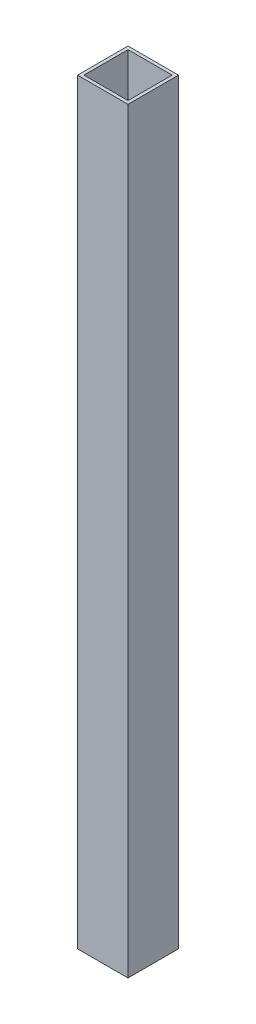
ISO-10303-21;
HEADER;
FILE_DESCRIPTION(('STEP AP214'),'2;1');
FILE_NAME('part.step','',(''),(''),'','','');
FILE_SCHEMA(('AUTOMOTIVE_DESIGN { 1 0 10303 214 1 1 1 1 }'));
ENDSEC;
DATA;
#1=APPLICATION_CONTEXT('core data for automotive mechanical design processes');
#2=APPLICATION_PROTOCOL_DEFINITION('international standard','automotive_design',2000,#1);
#3=PRODUCT_CONTEXT('',#1,'mechanical');
#4=PRODUCT('Part','Part','',(#3));
#5=PRODUCT_RELATED_PRODUCT_CATEGORY('part','',(#4));
#6=PRODUCT_DEFINITION_FORMATION('','',#4);
#7=PRODUCT_DEFINITION_CONTEXT('part definition',#1,'design');
#8=PRODUCT_DEFINITION('design','',#6,#7);
#9=PRODUCT_DEFINITION_SHAPE('','',#8);
#10=(LENGTH_UNIT() NAMED_UNIT(*) SI_UNIT(.MILLI.,.METRE.));
#11=(NAMED_UNIT(*) PLANE_ANGLE_UNIT() SI_UNIT($,.RADIAN.));
#12=(NAMED_UNIT(*) SI_UNIT($,.STERADIAN.) SOLID_ANGLE_UNIT());
#13=UNCERTAINTY_MEASURE_WITH_UNIT(LENGTH_MEASURE(1.E-05),#10,'distance_accuracy_value','');
#14=(GEOMETRIC_REPRESENTATION_CONTEXT(3) GLOBAL_UNCERTAINTY_ASSIGNED_CONTEXT((#13)) GLOBAL_UNIT_ASSIGNED_CONTEXT((#10,
#11,#12)) REPRESENTATION_CONTEXT('',''));
#15=CARTESIAN_POINT('',(0.,0.,0.));
#16=DIRECTION('',(0.,0.,1.));
#17=DIRECTION('',(1.,0.,0.));
#18=AXIS2_PLACEMENT_3D('',#15,#16,#17);
#19=CARTESIAN_POINT('',(0.,381.,0.));
#20=DIRECTION('',(0.,-1.,0.));
#21=DIRECTION('',(0.,0.,-1.));
#22=AXIS2_PLACEMENT_3D('',#19,#20,#21);
#23=PLANE('',#22);
#24=DIRECTION('',(0.,0.,-1.));
#25=VECTOR('',#24,1.);
#26=CARTESIAN_POINT('',(12.7,381.,12.7));
#27=LINE('',#26,#25);
#28=CARTESIAN_POINT('',(12.7,381.,12.7));
#29=VERTEX_POINT('',#28);
#30=CARTESIAN_POINT('',(12.7,381.,-12.7));
#31=VERTEX_POINT('',#30);
#32=EDGE_CURVE('E134',#29,#31,#27,.T.);
#33=ORIENTED_EDGE('',*,*,#32,.T.);
#34=DIRECTION('',(-1.,0.,0.));
#35=VECTOR('',#34,1.);
#36=CARTESIAN_POINT('',(-12.7,381.,-12.7));
#37=LINE('',#36,#35);
#38=CARTESIAN_POINT('',(-12.7,381.,-12.7));
#39=VERTEX_POINT('',#38);
#40=EDGE_CURVE('E137',#31,#39,#37,.T.);
#41=ORIENTED_EDGE('',*,*,#40,.T.);
#42=DIRECTION('',(0.,0.,1.));
#43=VECTOR('',#42,1.);
#44=CARTESIAN_POINT('',(-12.7,381.,12.7));
#45=LINE('',#44,#43);
#46=CARTESIAN_POINT('',(-12.7,381.,12.7));
#47=VERTEX_POINT('',#46);
#48=EDGE_CURVE('E140',#39,#47,#45,.T.);
#49=ORIENTED_EDGE('',*,*,#48,.T.);
#50=DIRECTION('',(1.,0.,0.));
#51=VECTOR('',#50,1.);
#52=CARTESIAN_POINT('',(-12.7,381.,12.7));
#53=LINE('',#52,#51);
#54=EDGE_CURVE('E142',#47,#29,#53,.T.);
#55=ORIENTED_EDGE('',*,*,#54,.T.);
#56=EDGE_LOOP('',(#33,#41,#49,#55));
#57=FACE_BOUND('',#56,.T.);
#58=DIRECTION('',(0.,0.,-1.));
#59=VECTOR('',#58,1.);
#60=CARTESIAN_POINT('',(11.1125,381.,11.1125));
#61=LINE('',#60,#59);
#62=CARTESIAN_POINT('',(11.1125,381.,11.1125));
#63=VERTEX_POINT('',#62);
#64=CARTESIAN_POINT('',(11.1125,381.,-11.1125));
#65=VERTEX_POINT('',#64);
#66=EDGE_CURVE('E98',#63,#65,#61,.T.);
#67=ORIENTED_EDGE('',*,*,#66,.F.);
#68=DIRECTION('',(1.,0.,0.));
#69=VECTOR('',#68,1.);
#70=CARTESIAN_POINT('',(-11.1125,381.,11.1125));
#71=LINE('',#70,#69);
#72=CARTESIAN_POINT('',(-11.1125,381.,11.1125));
#73=VERTEX_POINT('',#72);
#74=EDGE_CURVE('E120',#73,#63,#71,.T.);
#75=ORIENTED_EDGE('',*,*,#74,.F.);
#76=DIRECTION('',(0.,0.,1.));
#77=VECTOR('',#76,1.);
#78=CARTESIAN_POINT('',(-11.1125,381.,11.1125));
#79=LINE('',#78,#77);
#80=CARTESIAN_POINT('',(-11.1125,381.,-11.1125));
#81=VERTEX_POINT('',#80);
#82=EDGE_CURVE('E118',#81,#73,#79,.T.);
#83=ORIENTED_EDGE('',*,*,#82,.F.);
#84=DIRECTION('',(-1.,0.,0.));
#85=VECTOR('',#84,1.);
#86=CARTESIAN_POINT('',(-11.1125,381.,-11.1125));
#87=LINE('',#86,#85);
#88=EDGE_CURVE('E106',#65,#81,#87,.T.);
#89=ORIENTED_EDGE('',*,*,#88,.F.);
#90=EDGE_LOOP('',(#67,#75,#83,#89));
#91=FACE_BOUND('',#90,.T.);
#92=ADVANCED_FACE('F33',(#57,#91),#23,.F.);
#93=CARTESIAN_POINT('',(0.,0.,0.));
#94=DIRECTION('',(0.,-1.,0.));
#95=DIRECTION('',(0.,0.,-1.));
#96=AXIS2_PLACEMENT_3D('',#93,#94,#95);
#97=PLANE('',#96);
#98=DIRECTION('',(0.,0.,-1.));
#99=VECTOR('',#98,1.);
#100=CARTESIAN_POINT('',(12.7,0.,12.7));
#101=LINE('',#100,#99);
#102=CARTESIAN_POINT('',(12.7,0.,12.7));
#103=VERTEX_POINT('',#102);
#104=CARTESIAN_POINT('',(12.7,0.,-12.7));
#105=VERTEX_POINT('',#104);
#106=EDGE_CURVE('E114',#103,#105,#101,.T.);
#107=ORIENTED_EDGE('',*,*,#106,.F.);
#108=DIRECTION('',(1.,0.,0.));
#109=VECTOR('',#108,1.);
#110=CARTESIAN_POINT('',(-12.7,0.,12.7));
#111=LINE('',#110,#109);
#112=CARTESIAN_POINT('',(-12.7,0.,12.7));
#113=VERTEX_POINT('',#112);
#114=EDGE_CURVE('E138',#113,#103,#111,.T.);
#115=ORIENTED_EDGE('',*,*,#114,.F.);
#116=DIRECTION('',(0.,0.,1.));
#117=VECTOR('',#116,1.);
#118=CARTESIAN_POINT('',(-12.7,0.,12.7));
#119=LINE('',#118,#117);
#120=CARTESIAN_POINT('',(-12.7,0.,-12.7));
#121=VERTEX_POINT('',#120);
#122=EDGE_CURVE('E149',#121,#113,#119,.T.);
#123=ORIENTED_EDGE('',*,*,#122,.F.);
#124=DIRECTION('',(-1.,0.,0.));
#125=VECTOR('',#124,1.);
#126=CARTESIAN_POINT('',(-12.7,0.,-12.7));
#127=LINE('',#126,#125);
#128=EDGE_CURVE('E147',#105,#121,#127,.T.);
#129=ORIENTED_EDGE('',*,*,#128,.F.);
#130=EDGE_LOOP('',(#107,#115,#123,#129));
#131=FACE_BOUND('',#130,.T.);
#132=DIRECTION('',(1.,0.,0.));
#133=VECTOR('',#132,1.);
#134=CARTESIAN_POINT('',(-11.1125,0.,11.1125));
#135=LINE('',#134,#133);
#136=CARTESIAN_POINT('',(-11.1125,0.,11.1125));
#137=VERTEX_POINT('',#136);
#138=CARTESIAN_POINT('',(11.1125,0.,11.1125));
#139=VERTEX_POINT('',#138);
#140=EDGE_CURVE('E107',#137,#139,#135,.T.);
#141=ORIENTED_EDGE('',*,*,#140,.T.);
#142=DIRECTION('',(0.,0.,-1.));
#143=VECTOR('',#142,1.);
#144=CARTESIAN_POINT('',(11.1125,0.,11.1125));
#145=LINE('',#144,#143);
#146=CARTESIAN_POINT('',(11.1125,0.,-11.1125));
#147=VERTEX_POINT('',#146);
#148=EDGE_CURVE('E56',#139,#147,#145,.T.);
#149=ORIENTED_EDGE('',*,*,#148,.T.);
#150=DIRECTION('',(-1.,0.,0.));
#151=VECTOR('',#150,1.);
#152=CARTESIAN_POINT('',(-11.1125,0.,-11.1125));
#153=LINE('',#152,#151);
#154=CARTESIAN_POINT('',(-11.1125,0.,-11.1125));
#155=VERTEX_POINT('',#154);
#156=EDGE_CURVE('E113',#147,#155,#153,.T.);
#157=ORIENTED_EDGE('',*,*,#156,.T.);
#158=DIRECTION('',(0.,0.,1.));
#159=VECTOR('',#158,1.);
#160=CARTESIAN_POINT('',(-11.1125,0.,11.1125));
#161=LINE('',#160,#159);
#162=EDGE_CURVE('E126',#155,#137,#161,.T.);
#163=ORIENTED_EDGE('',*,*,#162,.T.);
#164=EDGE_LOOP('',(#141,#149,#157,#163));
#165=FACE_BOUND('',#164,.T.);
#166=ADVANCED_FACE('F167',(#131,#165),#97,.T.);
#167=CARTESIAN_POINT('',(12.7,381.,12.7));
#168=DIRECTION('',(-1.,0.,0.));
#169=DIRECTION('',(0.,0.,1.));
#170=AXIS2_PLACEMENT_3D('',#167,#168,#169);
#171=PLANE('',#170);
#172=ORIENTED_EDGE('',*,*,#106,.T.);
#173=DIRECTION('',(0.,-1.,0.));
#174=VECTOR('',#173,1.);
#175=CARTESIAN_POINT('',(12.7,381.,-12.7));
#176=LINE('',#175,#174);
#177=EDGE_CURVE('E11',#31,#105,#176,.T.);
#178=ORIENTED_EDGE('',*,*,#177,.F.);
#179=ORIENTED_EDGE('',*,*,#32,.F.);
#180=DIRECTION('',(0.,-1.,0.));
#181=VECTOR('',#180,1.);
#182=CARTESIAN_POINT('',(12.7,381.,12.7));
#183=LINE('',#182,#181);
#184=EDGE_CURVE('E144',#29,#103,#183,.T.);
#185=ORIENTED_EDGE('',*,*,#184,.T.);
#186=EDGE_LOOP('',(#172,#178,#179,#185));
#187=FACE_BOUND('',#186,.T.);
#188=ADVANCED_FACE('F35',(#187),#171,.F.);
#189=CARTESIAN_POINT('',(-12.7,381.,-12.7));
#190=DIRECTION('',(0.,0.,1.));
#191=DIRECTION('',(1.,0.,0.));
#192=AXIS2_PLACEMENT_3D('',#189,#190,#191);
#193=PLANE('',#192);
#194=ORIENTED_EDGE('',*,*,#128,.T.);
#195=DIRECTION('',(0.,-1.,0.));
#196=VECTOR('',#195,1.);
#197=CARTESIAN_POINT('',(-12.7,381.,-12.7));
#198=LINE('',#197,#196);
#199=EDGE_CURVE('E41',#39,#121,#198,.T.);
#200=ORIENTED_EDGE('',*,*,#199,.F.);
#201=ORIENTED_EDGE('',*,*,#40,.F.);
#202=ORIENTED_EDGE('',*,*,#177,.T.);
#203=EDGE_LOOP('',(#194,#200,#201,#202));
#204=FACE_BOUND('',#203,.T.);
#205=ADVANCED_FACE('F177',(#204),#193,.F.);
#206=CARTESIAN_POINT('',(-12.7,381.,12.7));
#207=DIRECTION('',(1.,0.,0.));
#208=DIRECTION('',(0.,0.,-1.));
#209=AXIS2_PLACEMENT_3D('',#206,#207,#208);
#210=PLANE('',#209);
#211=ORIENTED_EDGE('',*,*,#122,.T.);
#212=DIRECTION('',(0.,-1.,0.));
#213=VECTOR('',#212,1.);
#214=CARTESIAN_POINT('',(-12.7,381.,12.7));
#215=LINE('',#214,#213);
#216=EDGE_CURVE('E154',#47,#113,#215,.T.);
#217=ORIENTED_EDGE('',*,*,#216,.F.);
#218=ORIENTED_EDGE('',*,*,#48,.F.);
#219=ORIENTED_EDGE('',*,*,#199,.T.);
#220=EDGE_LOOP('',(#211,#217,#218,#219));
#221=FACE_BOUND('',#220,.T.);
#222=ADVANCED_FACE('F161',(#221),#210,.F.);
#223=CARTESIAN_POINT('',(-12.7,381.,12.7));
#224=DIRECTION('',(0.,0.,-1.));
#225=DIRECTION('',(-1.,0.,0.));
#226=AXIS2_PLACEMENT_3D('',#223,#224,#225);
#227=PLANE('',#226);
#228=ORIENTED_EDGE('',*,*,#114,.T.);
#229=ORIENTED_EDGE('',*,*,#184,.F.);
#230=ORIENTED_EDGE('',*,*,#54,.F.);
#231=ORIENTED_EDGE('',*,*,#216,.T.);
#232=EDGE_LOOP('',(#228,#229,#230,#231));
#233=FACE_BOUND('',#232,.T.);
#234=ADVANCED_FACE('F171',(#233),#227,.F.);
#235=CARTESIAN_POINT('',(11.1125,381.,11.1125));
#236=DIRECTION('',(-1.,0.,0.));
#237=DIRECTION('',(0.,0.,1.));
#238=AXIS2_PLACEMENT_3D('',#235,#236,#237);
#239=PLANE('',#238);
#240=ORIENTED_EDGE('',*,*,#148,.F.);
#241=DIRECTION('',(0.,-1.,0.));
#242=VECTOR('',#241,1.);
#243=CARTESIAN_POINT('',(11.1125,381.,11.1125));
#244=LINE('',#243,#242);
#245=EDGE_CURVE('E102',#63,#139,#244,.T.);
#246=ORIENTED_EDGE('',*,*,#245,.F.);
#247=ORIENTED_EDGE('',*,*,#66,.T.);
#248=DIRECTION('',(0.,-1.,0.));
#249=VECTOR('',#248,1.);
#250=CARTESIAN_POINT('',(11.1125,381.,-11.1125));
#251=LINE('',#250,#249);
#252=EDGE_CURVE('E101',#65,#147,#251,.T.);
#253=ORIENTED_EDGE('',*,*,#252,.T.);
#254=EDGE_LOOP('',(#240,#246,#247,#253));
#255=FACE_BOUND('',#254,.T.);
#256=ADVANCED_FACE('F100',(#255),#239,.T.);
#257=CARTESIAN_POINT('',(-11.1125,381.,-11.1125));
#258=DIRECTION('',(0.,0.,1.));
#259=DIRECTION('',(1.,0.,0.));
#260=AXIS2_PLACEMENT_3D('',#257,#258,#259);
#261=PLANE('',#260);
#262=ORIENTED_EDGE('',*,*,#156,.F.);
#263=ORIENTED_EDGE('',*,*,#252,.F.);
#264=ORIENTED_EDGE('',*,*,#88,.T.);
#265=DIRECTION('',(0.,-1.,0.));
#266=VECTOR('',#265,1.);
#267=CARTESIAN_POINT('',(-11.1125,381.,-11.1125));
#268=LINE('',#267,#266);
#269=EDGE_CURVE('E115',#81,#155,#268,.T.);
#270=ORIENTED_EDGE('',*,*,#269,.T.);
#271=EDGE_LOOP('',(#262,#263,#264,#270));
#272=FACE_BOUND('',#271,.T.);
#273=ADVANCED_FACE('F110',(#272),#261,.T.);
#274=CARTESIAN_POINT('',(-11.1125,381.,11.1125));
#275=DIRECTION('',(1.,0.,0.));
#276=DIRECTION('',(0.,0.,-1.));
#277=AXIS2_PLACEMENT_3D('',#274,#275,#276);
#278=PLANE('',#277);
#279=ORIENTED_EDGE('',*,*,#162,.F.);
#280=ORIENTED_EDGE('',*,*,#269,.F.);
#281=ORIENTED_EDGE('',*,*,#82,.T.);
#282=DIRECTION('',(0.,-1.,0.));
#283=VECTOR('',#282,1.);
#284=CARTESIAN_POINT('',(-11.1125,381.,11.1125));
#285=LINE('',#284,#283);
#286=EDGE_CURVE('E48',#73,#137,#285,.T.);
#287=ORIENTED_EDGE('',*,*,#286,.T.);
#288=EDGE_LOOP('',(#279,#280,#281,#287));
#289=FACE_BOUND('',#288,.T.);
#290=ADVANCED_FACE('F200',(#289),#278,.T.);
#291=CARTESIAN_POINT('',(-11.1125,381.,11.1125));
#292=DIRECTION('',(0.,0.,-1.));
#293=DIRECTION('',(-1.,0.,0.));
#294=AXIS2_PLACEMENT_3D('',#291,#292,#293);
#295=PLANE('',#294);
#296=ORIENTED_EDGE('',*,*,#140,.F.);
#297=ORIENTED_EDGE('',*,*,#286,.F.);
#298=ORIENTED_EDGE('',*,*,#74,.T.);
#299=ORIENTED_EDGE('',*,*,#245,.T.);
#300=EDGE_LOOP('',(#296,#297,#298,#299));
#301=FACE_BOUND('',#300,.T.);
#302=ADVANCED_FACE('F204',(#301),#295,.T.);
#303=CLOSED_SHELL('',(#92,#166,#188,#205,#222,#234,#256,#273,#290,#302));
#304=MANIFOLD_SOLID_BREP('B2',#303);
#305=ADVANCED_BREP_SHAPE_REPRESENTATION('',(#18,#304),#14);
#306=SHAPE_DEFINITION_REPRESENTATION(#9,#305);
ENDSEC;
END-ISO-10303-21;
